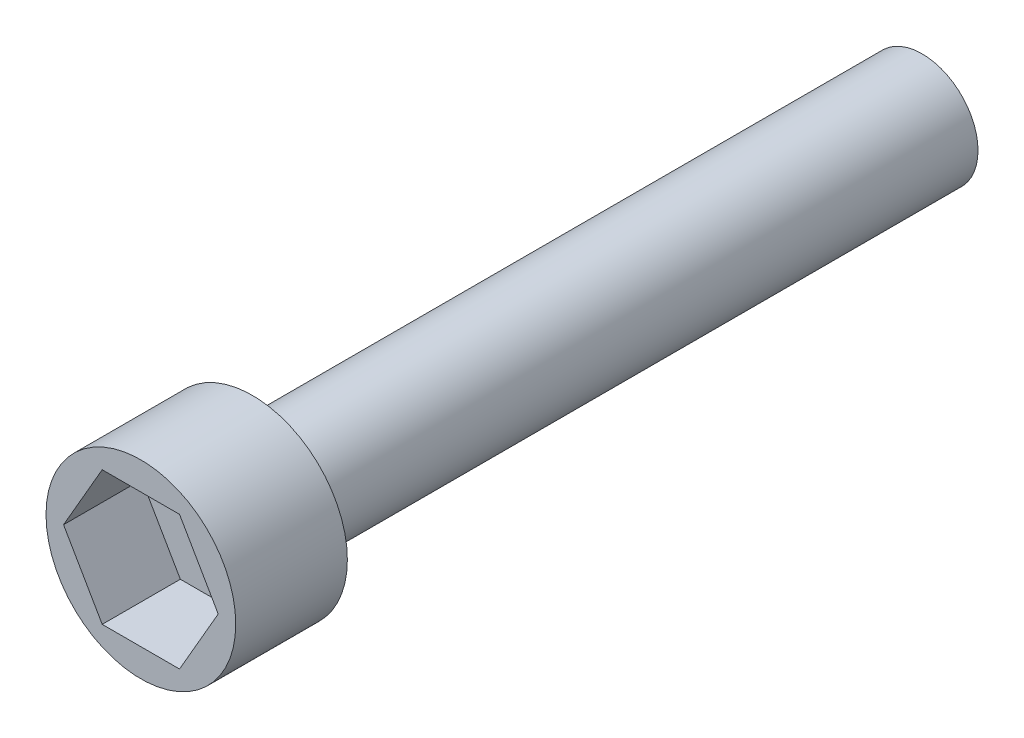
ISO-10303-21;
HEADER;
FILE_DESCRIPTION(('STEP AP214'),'2;1');
FILE_NAME('part.step','',(''),(''),'','','');
FILE_SCHEMA(('AUTOMOTIVE_DESIGN { 1 0 10303 214 1 1 1 1 }'));
ENDSEC;
DATA;
#1=APPLICATION_CONTEXT('core data for automotive mechanical design processes');
#2=APPLICATION_PROTOCOL_DEFINITION('international standard','automotive_design',2000,#1);
#3=PRODUCT_CONTEXT('',#1,'mechanical');
#4=PRODUCT('Part','Part','',(#3));
#5=PRODUCT_RELATED_PRODUCT_CATEGORY('part','',(#4));
#6=PRODUCT_DEFINITION_FORMATION('','',#4);
#7=PRODUCT_DEFINITION_CONTEXT('part definition',#1,'design');
#8=PRODUCT_DEFINITION('design','',#6,#7);
#9=PRODUCT_DEFINITION_SHAPE('','',#8);
#10=(LENGTH_UNIT() NAMED_UNIT(*) SI_UNIT(.MILLI.,.METRE.));
#11=(NAMED_UNIT(*) PLANE_ANGLE_UNIT() SI_UNIT($,.RADIAN.));
#12=(NAMED_UNIT(*) SI_UNIT($,.STERADIAN.) SOLID_ANGLE_UNIT());
#13=UNCERTAINTY_MEASURE_WITH_UNIT(LENGTH_MEASURE(1.E-05),#10,'distance_accuracy_value','');
#14=(GEOMETRIC_REPRESENTATION_CONTEXT(3) GLOBAL_UNCERTAINTY_ASSIGNED_CONTEXT((#13)) GLOBAL_UNIT_ASSIGNED_CONTEXT((#10,
#11,#12)) REPRESENTATION_CONTEXT('',''));
#15=CARTESIAN_POINT('',(0.,0.,0.));
#16=DIRECTION('',(0.,0.,1.));
#17=DIRECTION('',(1.,0.,0.));
#18=AXIS2_PLACEMENT_3D('',#15,#16,#17);
#19=CARTESIAN_POINT('',(0.,0.,30.));
#20=DIRECTION('',(0.,0.,-1.));
#21=DIRECTION('',(-1.,0.,0.));
#22=AXIS2_PLACEMENT_3D('',#19,#20,#21);
#23=CYLINDRICAL_SURFACE('',#22,2.5);
#24=CARTESIAN_POINT('',(0.,0.,30.));
#25=DIRECTION('',(0.,0.,1.));
#26=DIRECTION('',(1.,0.,0.));
#27=AXIS2_PLACEMENT_3D('',#24,#25,#26);
#28=CIRCLE('',#27,2.5);
#29=CARTESIAN_POINT('',(2.5,0.,30.));
#30=VERTEX_POINT('',#29);
#31=EDGE_CURVE('E11',#30,#30,#28,.T.);
#32=ORIENTED_EDGE('',*,*,#31,.F.);
#33=EDGE_LOOP('',(#32));
#34=FACE_BOUND('',#33,.T.);
#35=CARTESIAN_POINT('',(0.,0.,0.));
#36=DIRECTION('',(0.,0.,1.));
#37=DIRECTION('',(1.,0.,0.));
#38=AXIS2_PLACEMENT_3D('',#35,#36,#37);
#39=CIRCLE('',#38,2.5);
#40=CARTESIAN_POINT('',(2.5,0.,0.));
#41=VERTEX_POINT('',#40);
#42=EDGE_CURVE('E44',#41,#41,#39,.T.);
#43=ORIENTED_EDGE('',*,*,#42,.T.);
#44=EDGE_LOOP('',(#43));
#45=FACE_BOUND('',#44,.T.);
#46=ADVANCED_FACE('F41',(#34,#45),#23,.T.);
#47=CARTESIAN_POINT('',(0.,0.,0.));
#48=DIRECTION('',(0.,0.,1.));
#49=DIRECTION('',(1.,0.,0.));
#50=AXIS2_PLACEMENT_3D('',#47,#48,#49);
#51=PLANE('',#50);
#52=ORIENTED_EDGE('',*,*,#42,.F.);
#53=EDGE_LOOP('',(#52));
#54=FACE_BOUND('',#53,.T.);
#55=ADVANCED_FACE('F191',(#54),#51,.F.);
#56=CARTESIAN_POINT('',(0.,0.,35.));
#57=DIRECTION('',(0.,0.,-1.));
#58=DIRECTION('',(-1.,0.,0.));
#59=AXIS2_PLACEMENT_3D('',#56,#57,#58);
#60=CYLINDRICAL_SURFACE('',#59,4.25);
#61=CARTESIAN_POINT('',(0.,0.,35.));
#62=DIRECTION('',(0.,0.,1.));
#63=DIRECTION('',(1.,0.,0.));
#64=AXIS2_PLACEMENT_3D('',#61,#62,#63);
#65=CIRCLE('',#64,4.25);
#66=CARTESIAN_POINT('',(4.25,0.,35.));
#67=VERTEX_POINT('',#66);
#68=EDGE_CURVE('E165',#67,#67,#65,.T.);
#69=ORIENTED_EDGE('',*,*,#68,.F.);
#70=EDGE_LOOP('',(#69));
#71=FACE_BOUND('',#70,.T.);
#72=CARTESIAN_POINT('',(0.,0.,30.));
#73=DIRECTION('',(0.,0.,1.));
#74=DIRECTION('',(1.,0.,0.));
#75=AXIS2_PLACEMENT_3D('',#72,#73,#74);
#76=CIRCLE('',#75,4.25);
#77=CARTESIAN_POINT('',(4.25,0.,30.));
#78=VERTEX_POINT('',#77);
#79=EDGE_CURVE('E155',#78,#78,#76,.T.);
#80=ORIENTED_EDGE('',*,*,#79,.T.);
#81=EDGE_LOOP('',(#80));
#82=FACE_BOUND('',#81,.T.);
#83=ADVANCED_FACE('F173',(#71,#82),#60,.T.);
#84=CARTESIAN_POINT('',(0.,0.,35.));
#85=DIRECTION('',(0.,0.,1.));
#86=DIRECTION('',(1.,0.,0.));
#87=AXIS2_PLACEMENT_3D('',#84,#85,#86);
#88=PLANE('',#87);
#89=DIRECTION('',(0.5,0.866025403784439,0.));
#90=VECTOR('',#89,1.);
#91=CARTESIAN_POINT('',(1.73205080756888,-3.,35.));
#92=LINE('',#91,#90);
#93=CARTESIAN_POINT('',(1.73205080756888,-3.,35.));
#94=VERTEX_POINT('',#93);
#95=CARTESIAN_POINT('',(3.46410161513775,0.,35.));
#96=VERTEX_POINT('',#95);
#97=EDGE_CURVE('E56',#94,#96,#92,.T.);
#98=ORIENTED_EDGE('',*,*,#97,.F.);
#99=DIRECTION('',(1.,0.,0.));
#100=VECTOR('',#99,1.);
#101=CARTESIAN_POINT('',(-1.73205080756888,-3.,35.));
#102=LINE('',#101,#100);
#103=CARTESIAN_POINT('',(-1.73205080756888,-3.,35.));
#104=VERTEX_POINT('',#103);
#105=EDGE_CURVE('E149',#104,#94,#102,.T.);
#106=ORIENTED_EDGE('',*,*,#105,.F.);
#107=DIRECTION('',(0.5,-0.866025403784439,0.));
#108=VECTOR('',#107,1.);
#109=CARTESIAN_POINT('',(-3.46410161513775,0.,35.));
#110=LINE('',#109,#108);
#111=CARTESIAN_POINT('',(-3.46410161513775,0.,35.));
#112=VERTEX_POINT('',#111);
#113=EDGE_CURVE('E146',#112,#104,#110,.T.);
#114=ORIENTED_EDGE('',*,*,#113,.F.);
#115=DIRECTION('',(-0.5,-0.866025403784439,0.));
#116=VECTOR('',#115,1.);
#117=CARTESIAN_POINT('',(-1.73205080756888,3.,35.));
#118=LINE('',#117,#116);
#119=CARTESIAN_POINT('',(-1.73205080756888,3.,35.));
#120=VERTEX_POINT('',#119);
#121=EDGE_CURVE('E104',#120,#112,#118,.T.);
#122=ORIENTED_EDGE('',*,*,#121,.F.);
#123=DIRECTION('',(-1.,0.,0.));
#124=VECTOR('',#123,1.);
#125=CARTESIAN_POINT('',(1.73205080756888,3.,35.));
#126=LINE('',#125,#124);
#127=CARTESIAN_POINT('',(1.73205080756888,3.,35.));
#128=VERTEX_POINT('',#127);
#129=EDGE_CURVE('E140',#128,#120,#126,.T.);
#130=ORIENTED_EDGE('',*,*,#129,.F.);
#131=DIRECTION('',(-0.5,0.866025403784438,0.));
#132=VECTOR('',#131,1.);
#133=CARTESIAN_POINT('',(3.46410161513775,0.,35.));
#134=LINE('',#133,#132);
#135=EDGE_CURVE('E136',#96,#128,#134,.T.);
#136=ORIENTED_EDGE('',*,*,#135,.F.);
#137=EDGE_LOOP('',(#98,#106,#114,#122,#130,#136));
#138=FACE_BOUND('',#137,.T.);
#139=ORIENTED_EDGE('',*,*,#68,.T.);
#140=EDGE_LOOP('',(#139));
#141=FACE_BOUND('',#140,.T.);
#142=ADVANCED_FACE('F178',(#138,#141),#88,.T.);
#143=CARTESIAN_POINT('',(0.,0.,30.));
#144=DIRECTION('',(0.,0.,1.));
#145=DIRECTION('',(1.,0.,0.));
#146=AXIS2_PLACEMENT_3D('',#143,#144,#145);
#147=PLANE('',#146);
#148=ORIENTED_EDGE('',*,*,#31,.T.);
#149=EDGE_LOOP('',(#148));
#150=FACE_BOUND('',#149,.T.);
#151=ORIENTED_EDGE('',*,*,#79,.F.);
#152=EDGE_LOOP('',(#151));
#153=FACE_BOUND('',#152,.T.);
#154=ADVANCED_FACE('F175',(#150,#153),#147,.F.);
#155=CARTESIAN_POINT('',(1.73205080756888,-3.,31.5));
#156=DIRECTION('',(0.866025403784439,-0.5,0.));
#157=DIRECTION('',(0.5,0.866025403784439,0.));
#158=AXIS2_PLACEMENT_3D('',#155,#156,#157);
#159=PLANE('',#158);
#160=ORIENTED_EDGE('',*,*,#97,.T.);
#161=DIRECTION('',(0.,0.,1.));
#162=VECTOR('',#161,1.);
#163=CARTESIAN_POINT('',(3.46410161513775,0.,31.5));
#164=LINE('',#163,#162);
#165=CARTESIAN_POINT('',(3.46410161513775,0.,31.5));
#166=VERTEX_POINT('',#165);
#167=EDGE_CURVE('E86',#166,#96,#164,.T.);
#168=ORIENTED_EDGE('',*,*,#167,.F.);
#169=DIRECTION('',(0.5,0.866025403784439,0.));
#170=VECTOR('',#169,1.);
#171=CARTESIAN_POINT('',(1.73205080756888,-3.,31.5));
#172=LINE('',#171,#170);
#173=CARTESIAN_POINT('',(1.73205080756888,-3.,31.5));
#174=VERTEX_POINT('',#173);
#175=EDGE_CURVE('E152',#174,#166,#172,.T.);
#176=ORIENTED_EDGE('',*,*,#175,.F.);
#177=DIRECTION('',(0.,0.,1.));
#178=VECTOR('',#177,1.);
#179=CARTESIAN_POINT('',(1.73205080756888,-3.,31.5));
#180=LINE('',#179,#178);
#181=EDGE_CURVE('E64',#174,#94,#180,.T.);
#182=ORIENTED_EDGE('',*,*,#181,.T.);
#183=EDGE_LOOP('',(#160,#168,#176,#182));
#184=FACE_BOUND('',#183,.T.);
#185=ADVANCED_FACE('F177',(#184),#159,.F.);
#186=CARTESIAN_POINT('',(-1.73205080756888,-3.,31.5));
#187=DIRECTION('',(0.,-1.,0.));
#188=DIRECTION('',(0.,0.,-1.));
#189=AXIS2_PLACEMENT_3D('',#186,#187,#188);
#190=PLANE('',#189);
#191=ORIENTED_EDGE('',*,*,#105,.T.);
#192=ORIENTED_EDGE('',*,*,#181,.F.);
#193=DIRECTION('',(1.,0.,0.));
#194=VECTOR('',#193,1.);
#195=CARTESIAN_POINT('',(-1.73205080756888,-3.,31.5));
#196=LINE('',#195,#194);
#197=CARTESIAN_POINT('',(-1.73205080756888,-3.,31.5));
#198=VERTEX_POINT('',#197);
#199=EDGE_CURVE('E118',#198,#174,#196,.T.);
#200=ORIENTED_EDGE('',*,*,#199,.F.);
#201=DIRECTION('',(0.,0.,1.));
#202=VECTOR('',#201,1.);
#203=CARTESIAN_POINT('',(-1.73205080756888,-3.,31.5));
#204=LINE('',#203,#202);
#205=EDGE_CURVE('E109',#198,#104,#204,.T.);
#206=ORIENTED_EDGE('',*,*,#205,.T.);
#207=EDGE_LOOP('',(#191,#192,#200,#206));
#208=FACE_BOUND('',#207,.T.);
#209=ADVANCED_FACE('F185',(#208),#190,.F.);
#210=CARTESIAN_POINT('',(-3.46410161513775,0.,31.5));
#211=DIRECTION('',(-0.866025403784439,-0.5,0.));
#212=DIRECTION('',(0.5,-0.866025403784439,0.));
#213=AXIS2_PLACEMENT_3D('',#210,#211,#212);
#214=PLANE('',#213);
#215=ORIENTED_EDGE('',*,*,#113,.T.);
#216=ORIENTED_EDGE('',*,*,#205,.F.);
#217=DIRECTION('',(0.5,-0.866025403784439,0.));
#218=VECTOR('',#217,1.);
#219=CARTESIAN_POINT('',(-3.46410161513775,0.,31.5));
#220=LINE('',#219,#218);
#221=CARTESIAN_POINT('',(-3.46410161513775,0.,31.5));
#222=VERTEX_POINT('',#221);
#223=EDGE_CURVE('E113',#222,#198,#220,.T.);
#224=ORIENTED_EDGE('',*,*,#223,.F.);
#225=DIRECTION('',(0.,0.,1.));
#226=VECTOR('',#225,1.);
#227=CARTESIAN_POINT('',(-3.46410161513775,0.,31.5));
#228=LINE('',#227,#226);
#229=EDGE_CURVE('E97',#222,#112,#228,.T.);
#230=ORIENTED_EDGE('',*,*,#229,.T.);
#231=EDGE_LOOP('',(#215,#216,#224,#230));
#232=FACE_BOUND('',#231,.T.);
#233=ADVANCED_FACE('F114',(#232),#214,.F.);
#234=CARTESIAN_POINT('',(-1.73205080756888,3.,31.5));
#235=DIRECTION('',(-0.866025403784439,0.5,0.));
#236=DIRECTION('',(-0.5,-0.866025403784439,0.));
#237=AXIS2_PLACEMENT_3D('',#234,#235,#236);
#238=PLANE('',#237);
#239=ORIENTED_EDGE('',*,*,#121,.T.);
#240=ORIENTED_EDGE('',*,*,#229,.F.);
#241=DIRECTION('',(-0.5,-0.866025403784439,0.));
#242=VECTOR('',#241,1.);
#243=CARTESIAN_POINT('',(-1.73205080756888,3.,31.5));
#244=LINE('',#243,#242);
#245=CARTESIAN_POINT('',(-1.73205080756888,3.,31.5));
#246=VERTEX_POINT('',#245);
#247=EDGE_CURVE('E101',#246,#222,#244,.T.);
#248=ORIENTED_EDGE('',*,*,#247,.F.);
#249=DIRECTION('',(0.,0.,1.));
#250=VECTOR('',#249,1.);
#251=CARTESIAN_POINT('',(-1.73205080756888,3.,31.5));
#252=LINE('',#251,#250);
#253=EDGE_CURVE('E110',#246,#120,#252,.T.);
#254=ORIENTED_EDGE('',*,*,#253,.T.);
#255=EDGE_LOOP('',(#239,#240,#248,#254));
#256=FACE_BOUND('',#255,.T.);
#257=ADVANCED_FACE('F99',(#256),#238,.F.);
#258=CARTESIAN_POINT('',(1.73205080756888,3.,31.5));
#259=DIRECTION('',(0.,1.,0.));
#260=DIRECTION('',(0.,0.,1.));
#261=AXIS2_PLACEMENT_3D('',#258,#259,#260);
#262=PLANE('',#261);
#263=ORIENTED_EDGE('',*,*,#129,.T.);
#264=ORIENTED_EDGE('',*,*,#253,.F.);
#265=DIRECTION('',(-1.,0.,0.));
#266=VECTOR('',#265,1.);
#267=CARTESIAN_POINT('',(1.73205080756888,3.,31.5));
#268=LINE('',#267,#266);
#269=CARTESIAN_POINT('',(1.73205080756888,3.,31.5));
#270=VERTEX_POINT('',#269);
#271=EDGE_CURVE('E124',#270,#246,#268,.T.);
#272=ORIENTED_EDGE('',*,*,#271,.F.);
#273=DIRECTION('',(0.,0.,1.));
#274=VECTOR('',#273,1.);
#275=CARTESIAN_POINT('',(1.73205080756888,3.,31.5));
#276=LINE('',#275,#274);
#277=EDGE_CURVE('E160',#270,#128,#276,.T.);
#278=ORIENTED_EDGE('',*,*,#277,.T.);
#279=EDGE_LOOP('',(#263,#264,#272,#278));
#280=FACE_BOUND('',#279,.T.);
#281=ADVANCED_FACE('F247',(#280),#262,.F.);
#282=CARTESIAN_POINT('',(3.46410161513775,0.,31.5));
#283=DIRECTION('',(0.866025403784438,0.5,0.));
#284=DIRECTION('',(-0.5,0.866025403784439,0.));
#285=AXIS2_PLACEMENT_3D('',#282,#283,#284);
#286=PLANE('',#285);
#287=ORIENTED_EDGE('',*,*,#135,.T.);
#288=ORIENTED_EDGE('',*,*,#277,.F.);
#289=DIRECTION('',(-0.5,0.866025403784438,0.));
#290=VECTOR('',#289,1.);
#291=CARTESIAN_POINT('',(3.46410161513775,0.,31.5));
#292=LINE('',#291,#290);
#293=EDGE_CURVE('E128',#166,#270,#292,.T.);
#294=ORIENTED_EDGE('',*,*,#293,.F.);
#295=ORIENTED_EDGE('',*,*,#167,.T.);
#296=EDGE_LOOP('',(#287,#288,#294,#295));
#297=FACE_BOUND('',#296,.T.);
#298=ADVANCED_FACE('F256',(#297),#286,.F.);
#299=CARTESIAN_POINT('',(0.,0.,31.5));
#300=DIRECTION('',(0.,0.,1.));
#301=DIRECTION('',(1.,0.,0.));
#302=AXIS2_PLACEMENT_3D('',#299,#300,#301);
#303=PLANE('',#302);
#304=ORIENTED_EDGE('',*,*,#175,.T.);
#305=ORIENTED_EDGE('',*,*,#293,.T.);
#306=ORIENTED_EDGE('',*,*,#271,.T.);
#307=ORIENTED_EDGE('',*,*,#247,.T.);
#308=ORIENTED_EDGE('',*,*,#223,.T.);
#309=ORIENTED_EDGE('',*,*,#199,.T.);
#310=EDGE_LOOP('',(#304,#305,#306,#307,#308,#309));
#311=FACE_BOUND('',#310,.T.);
#312=ADVANCED_FACE('F121',(#311),#303,.T.);
#313=CLOSED_SHELL('',(#46,#55,#83,#142,#154,#185,#209,#233,#257,#281,#298,#312));
#314=MANIFOLD_SOLID_BREP('B2',#313);
#315=ADVANCED_BREP_SHAPE_REPRESENTATION('',(#18,#314),#14);
#316=SHAPE_DEFINITION_REPRESENTATION(#9,#315);
ENDSEC;
END-ISO-10303-21;
